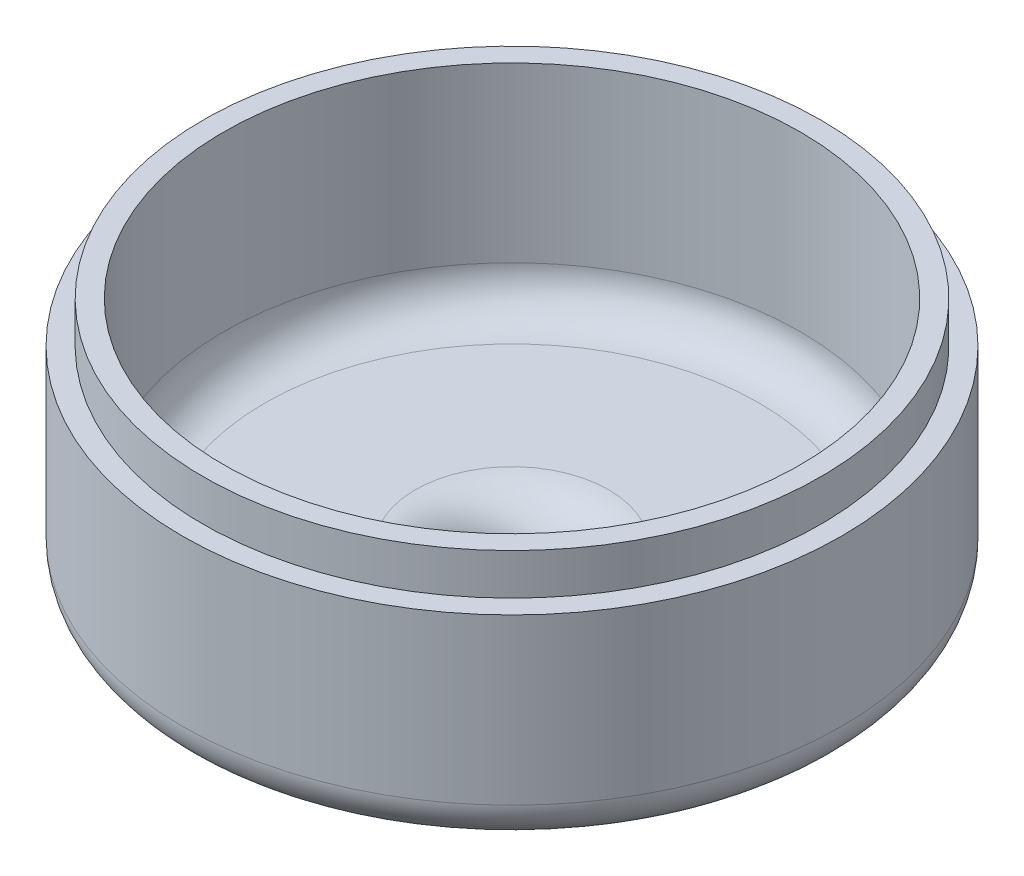
ISO-10303-21;
HEADER;
FILE_DESCRIPTION(('STEP AP214'),'2;1');
FILE_NAME('part.step','',(''),(''),'','','');
FILE_SCHEMA(('AUTOMOTIVE_DESIGN { 1 0 10303 214 1 1 1 1 }'));
ENDSEC;
DATA;
#1=APPLICATION_CONTEXT('core data for automotive mechanical design processes');
#2=APPLICATION_PROTOCOL_DEFINITION('international standard','automotive_design',2000,#1);
#3=PRODUCT_CONTEXT('',#1,'mechanical');
#4=PRODUCT('Part','Part','',(#3));
#5=PRODUCT_RELATED_PRODUCT_CATEGORY('part','',(#4));
#6=PRODUCT_DEFINITION_FORMATION('','',#4);
#7=PRODUCT_DEFINITION_CONTEXT('part definition',#1,'design');
#8=PRODUCT_DEFINITION('design','',#6,#7);
#9=PRODUCT_DEFINITION_SHAPE('','',#8);
#10=(LENGTH_UNIT() NAMED_UNIT(*) SI_UNIT(.MILLI.,.METRE.));
#11=(NAMED_UNIT(*) PLANE_ANGLE_UNIT() SI_UNIT($,.RADIAN.));
#12=(NAMED_UNIT(*) SI_UNIT($,.STERADIAN.) SOLID_ANGLE_UNIT());
#13=UNCERTAINTY_MEASURE_WITH_UNIT(LENGTH_MEASURE(1.E-05),#10,'distance_accuracy_value','');
#14=(GEOMETRIC_REPRESENTATION_CONTEXT(3) GLOBAL_UNCERTAINTY_ASSIGNED_CONTEXT((#13)) GLOBAL_UNIT_ASSIGNED_CONTEXT((#10,
#11,#12)) REPRESENTATION_CONTEXT('',''));
#15=CARTESIAN_POINT('',(0.,0.,0.));
#16=DIRECTION('',(0.,0.,1.));
#17=DIRECTION('',(1.,0.,0.));
#18=AXIS2_PLACEMENT_3D('',#15,#16,#17);
#19=CARTESIAN_POINT('',(0.,-26.,0.));
#20=DIRECTION('',(0.,-1.,0.));
#21=DIRECTION('',(0.,0.,-1.));
#22=AXIS2_PLACEMENT_3D('',#19,#20,#21);
#23=TOROIDAL_SURFACE('',#22,16.,6.);
#24=CARTESIAN_POINT('',(0.,-26.,0.));
#25=DIRECTION('',(0.,-1.,0.));
#26=DIRECTION('',(0.,0.,-1.));
#27=AXIS2_PLACEMENT_3D('',#24,#25,#26);
#28=CIRCLE('',#27,10.);
#29=CARTESIAN_POINT('',(0.,-26.,-10.));
#30=VERTEX_POINT('',#29);
#31=EDGE_CURVE('E10',#30,#30,#28,.T.);
#32=ORIENTED_EDGE('',*,*,#31,.F.);
#33=EDGE_LOOP('',(#32));
#34=FACE_BOUND('',#33,.T.);
#35=CARTESIAN_POINT('',(0.,-20.,0.));
#36=DIRECTION('',(0.,-1.,0.));
#37=DIRECTION('',(0.,0.,-1.));
#38=AXIS2_PLACEMENT_3D('',#35,#36,#37);
#39=CIRCLE('',#38,16.);
#40=CARTESIAN_POINT('',(0.,-20.,-16.));
#41=VERTEX_POINT('',#40);
#42=EDGE_CURVE('E77',#41,#41,#39,.T.);
#43=ORIENTED_EDGE('',*,*,#42,.T.);
#44=EDGE_LOOP('',(#43));
#45=FACE_BOUND('',#44,.T.);
#46=ADVANCED_FACE('F31',(#34,#45),#23,.F.);
#47=CARTESIAN_POINT('',(0.,0.,0.));
#48=DIRECTION('',(0.,-1.,0.));
#49=DIRECTION('',(0.,0.,-1.));
#50=AXIS2_PLACEMENT_3D('',#47,#48,#49);
#51=CYLINDRICAL_SURFACE('',#50,10.);
#52=CARTESIAN_POINT('',(0.,-28.4862875131965,0.));
#53=DIRECTION('',(0.,-1.,0.));
#54=DIRECTION('',(0.,0.,-1.));
#55=AXIS2_PLACEMENT_3D('',#52,#53,#54);
#56=CIRCLE('',#55,10.);
#57=CARTESIAN_POINT('',(0.,-28.4862875131965,-10.));
#58=VERTEX_POINT('',#57);
#59=EDGE_CURVE('E37',#58,#58,#56,.T.);
#60=ORIENTED_EDGE('',*,*,#59,.F.);
#61=EDGE_LOOP('',(#60));
#62=FACE_BOUND('',#61,.T.);
#63=ORIENTED_EDGE('',*,*,#31,.T.);
#64=EDGE_LOOP('',(#63));
#65=FACE_BOUND('',#64,.T.);
#66=ADVANCED_FACE('F150',(#62,#65),#51,.T.);
#67=CARTESIAN_POINT('',(-10.,-28.4862875131965,0.));
#68=DIRECTION('',(0.,1.,0.));
#69=DIRECTION('',(0.,0.,1.));
#70=AXIS2_PLACEMENT_3D('',#67,#68,#69);
#71=PLANE('',#70);
#72=CARTESIAN_POINT('',(0.,-28.4862875131965,0.));
#73=DIRECTION('',(0.,-1.,0.));
#74=DIRECTION('',(0.,0.,-1.));
#75=AXIS2_PLACEMENT_3D('',#72,#73,#74);
#76=CIRCLE('',#75,5.75);
#77=CARTESIAN_POINT('',(0.,-28.4862875131965,-5.75));
#78=VERTEX_POINT('',#77);
#79=EDGE_CURVE('E41',#78,#78,#76,.T.);
#80=ORIENTED_EDGE('',*,*,#79,.F.);
#81=EDGE_LOOP('',(#80));
#82=FACE_BOUND('',#81,.T.);
#83=ORIENTED_EDGE('',*,*,#59,.T.);
#84=EDGE_LOOP('',(#83));
#85=FACE_BOUND('',#84,.T.);
#86=ADVANCED_FACE('F145',(#82,#85),#71,.F.);
#87=CARTESIAN_POINT('',(0.,0.,0.));
#88=DIRECTION('',(0.,-1.,0.));
#89=DIRECTION('',(0.,0.,-1.));
#90=AXIS2_PLACEMENT_3D('',#87,#88,#89);
#91=CYLINDRICAL_SURFACE('',#90,5.75);
#92=CARTESIAN_POINT('',(0.,-22.,0.));
#93=DIRECTION('',(0.,-1.,0.));
#94=DIRECTION('',(0.,0.,-1.));
#95=AXIS2_PLACEMENT_3D('',#92,#93,#94);
#96=CIRCLE('',#95,5.75);
#97=CARTESIAN_POINT('',(0.,-22.,-5.75));
#98=VERTEX_POINT('',#97);
#99=EDGE_CURVE('E45',#98,#98,#96,.T.);
#100=ORIENTED_EDGE('',*,*,#99,.F.);
#101=EDGE_LOOP('',(#100));
#102=FACE_BOUND('',#101,.T.);
#103=ORIENTED_EDGE('',*,*,#79,.T.);
#104=EDGE_LOOP('',(#103));
#105=FACE_BOUND('',#104,.T.);
#106=ADVANCED_FACE('F139',(#102,#105),#91,.F.);
#107=CARTESIAN_POINT('',(0.,-22.,0.));
#108=DIRECTION('',(0.,-1.,0.));
#109=DIRECTION('',(0.,0.,-1.));
#110=AXIS2_PLACEMENT_3D('',#107,#108,#109);
#111=TOROIDAL_SURFACE('',#110,11.75,6.);
#112=CARTESIAN_POINT('',(0.,-16.,0.));
#113=DIRECTION('',(0.,-1.,0.));
#114=DIRECTION('',(0.,0.,-1.));
#115=AXIS2_PLACEMENT_3D('',#112,#113,#114);
#116=CIRCLE('',#115,11.75);
#117=CARTESIAN_POINT('',(0.,-16.,-11.75));
#118=VERTEX_POINT('',#117);
#119=EDGE_CURVE('E50',#118,#118,#116,.T.);
#120=ORIENTED_EDGE('',*,*,#119,.F.);
#121=EDGE_LOOP('',(#120));
#122=FACE_BOUND('',#121,.T.);
#123=ORIENTED_EDGE('',*,*,#99,.T.);
#124=EDGE_LOOP('',(#123));
#125=FACE_BOUND('',#124,.T.);
#126=ADVANCED_FACE('F133',(#122,#125),#111,.T.);
#127=CARTESIAN_POINT('',(-30.,-16.,0.));
#128=DIRECTION('',(0.,-1.,0.));
#129=DIRECTION('',(0.,0.,-1.));
#130=AXIS2_PLACEMENT_3D('',#127,#128,#129);
#131=PLANE('',#130);
#132=CARTESIAN_POINT('',(0.,-16.,0.));
#133=DIRECTION('',(0.,-1.,0.));
#134=DIRECTION('',(0.,0.,-1.));
#135=AXIS2_PLACEMENT_3D('',#132,#133,#134);
#136=CIRCLE('',#135,30.);
#137=CARTESIAN_POINT('',(0.,-16.,-30.));
#138=VERTEX_POINT('',#137);
#139=EDGE_CURVE('E53',#138,#138,#136,.T.);
#140=ORIENTED_EDGE('',*,*,#139,.F.);
#141=EDGE_LOOP('',(#140));
#142=FACE_BOUND('',#141,.T.);
#143=ORIENTED_EDGE('',*,*,#119,.T.);
#144=EDGE_LOOP('',(#143));
#145=FACE_BOUND('',#144,.T.);
#146=ADVANCED_FACE('F127',(#142,#145),#131,.F.);
#147=CARTESIAN_POINT('',(0.,-11.,0.));
#148=DIRECTION('',(0.,-1.,0.));
#149=DIRECTION('',(0.,0.,-1.));
#150=AXIS2_PLACEMENT_3D('',#147,#148,#149);
#151=TOROIDAL_SURFACE('',#150,30.,5.00000000000001);
#152=CARTESIAN_POINT('',(0.,-11.,0.));
#153=DIRECTION('',(0.,-1.,0.));
#154=DIRECTION('',(0.,0.,-1.));
#155=AXIS2_PLACEMENT_3D('',#152,#153,#154);
#156=CIRCLE('',#155,35.);
#157=CARTESIAN_POINT('',(0.,-11.,-35.));
#158=VERTEX_POINT('',#157);
#159=EDGE_CURVE('E56',#158,#158,#156,.T.);
#160=ORIENTED_EDGE('',*,*,#159,.F.);
#161=EDGE_LOOP('',(#160));
#162=FACE_BOUND('',#161,.T.);
#163=ORIENTED_EDGE('',*,*,#139,.T.);
#164=EDGE_LOOP('',(#163));
#165=FACE_BOUND('',#164,.T.);
#166=ADVANCED_FACE('F121',(#162,#165),#151,.F.);
#167=CARTESIAN_POINT('',(0.,0.,0.));
#168=DIRECTION('',(0.,-1.,0.));
#169=DIRECTION('',(0.,0.,-1.));
#170=AXIS2_PLACEMENT_3D('',#167,#168,#169);
#171=CYLINDRICAL_SURFACE('',#170,35.);
#172=CARTESIAN_POINT('',(0.,10.,0.));
#173=DIRECTION('',(0.,-1.,0.));
#174=DIRECTION('',(0.,0.,-1.));
#175=AXIS2_PLACEMENT_3D('',#172,#173,#174);
#176=CIRCLE('',#175,35.);
#177=CARTESIAN_POINT('',(0.,10.,-35.));
#178=VERTEX_POINT('',#177);
#179=EDGE_CURVE('E59',#178,#178,#176,.T.);
#180=ORIENTED_EDGE('',*,*,#179,.F.);
#181=EDGE_LOOP('',(#180));
#182=FACE_BOUND('',#181,.T.);
#183=ORIENTED_EDGE('',*,*,#159,.T.);
#184=EDGE_LOOP('',(#183));
#185=FACE_BOUND('',#184,.T.);
#186=ADVANCED_FACE('F115',(#182,#185),#171,.F.);
#187=CARTESIAN_POINT('',(-37.5,10.,0.));
#188=DIRECTION('',(0.,-1.,0.));
#189=DIRECTION('',(0.,0.,-1.));
#190=AXIS2_PLACEMENT_3D('',#187,#188,#189);
#191=PLANE('',#190);
#192=CARTESIAN_POINT('',(0.,10.,0.));
#193=DIRECTION('',(0.,-1.,0.));
#194=DIRECTION('',(0.,0.,-1.));
#195=AXIS2_PLACEMENT_3D('',#192,#193,#194);
#196=CIRCLE('',#195,37.5);
#197=CARTESIAN_POINT('',(0.,10.,-37.5));
#198=VERTEX_POINT('',#197);
#199=EDGE_CURVE('E62',#198,#198,#196,.T.);
#200=ORIENTED_EDGE('',*,*,#199,.F.);
#201=EDGE_LOOP('',(#200));
#202=FACE_BOUND('',#201,.T.);
#203=ORIENTED_EDGE('',*,*,#179,.T.);
#204=EDGE_LOOP('',(#203));
#205=FACE_BOUND('',#204,.T.);
#206=ADVANCED_FACE('F109',(#202,#205),#191,.F.);
#207=CARTESIAN_POINT('',(0.,0.,0.));
#208=DIRECTION('',(0.,-1.,0.));
#209=DIRECTION('',(0.,0.,-1.));
#210=AXIS2_PLACEMENT_3D('',#207,#208,#209);
#211=CYLINDRICAL_SURFACE('',#210,37.5);
#212=CARTESIAN_POINT('',(0.,5.,0.));
#213=DIRECTION('',(0.,-1.,0.));
#214=DIRECTION('',(0.,0.,-1.));
#215=AXIS2_PLACEMENT_3D('',#212,#213,#214);
#216=CIRCLE('',#215,37.5);
#217=CARTESIAN_POINT('',(0.,5.,-37.5));
#218=VERTEX_POINT('',#217);
#219=EDGE_CURVE('E65',#218,#218,#216,.T.);
#220=ORIENTED_EDGE('',*,*,#219,.F.);
#221=EDGE_LOOP('',(#220));
#222=FACE_BOUND('',#221,.T.);
#223=ORIENTED_EDGE('',*,*,#199,.T.);
#224=EDGE_LOOP('',(#223));
#225=FACE_BOUND('',#224,.T.);
#226=ADVANCED_FACE('F103',(#222,#225),#211,.T.);
#227=CARTESIAN_POINT('',(-37.5,5.,0.));
#228=DIRECTION('',(0.,-1.,0.));
#229=DIRECTION('',(0.,0.,-1.));
#230=AXIS2_PLACEMENT_3D('',#227,#228,#229);
#231=PLANE('',#230);
#232=CARTESIAN_POINT('',(0.,4.99999999999999,0.));
#233=DIRECTION('',(0.,-1.,0.));
#234=DIRECTION('',(0.,0.,-1.));
#235=AXIS2_PLACEMENT_3D('',#232,#233,#234);
#236=CIRCLE('',#235,40.);
#237=CARTESIAN_POINT('',(0.,4.99999999999999,-40.));
#238=VERTEX_POINT('',#237);
#239=EDGE_CURVE('E68',#238,#238,#236,.T.);
#240=ORIENTED_EDGE('',*,*,#239,.F.);
#241=EDGE_LOOP('',(#240));
#242=FACE_BOUND('',#241,.T.);
#243=ORIENTED_EDGE('',*,*,#219,.T.);
#244=EDGE_LOOP('',(#243));
#245=FACE_BOUND('',#244,.T.);
#246=ADVANCED_FACE('F97',(#242,#245),#231,.F.);
#247=CARTESIAN_POINT('',(0.,0.,0.));
#248=DIRECTION('',(0.,-1.,0.));
#249=DIRECTION('',(0.,0.,-1.));
#250=AXIS2_PLACEMENT_3D('',#247,#248,#249);
#251=CYLINDRICAL_SURFACE('',#250,40.);
#252=CARTESIAN_POINT('',(0.,-15.,0.));
#253=DIRECTION('',(0.,-1.,0.));
#254=DIRECTION('',(0.,0.,-1.));
#255=AXIS2_PLACEMENT_3D('',#252,#253,#254);
#256=CIRCLE('',#255,40.);
#257=CARTESIAN_POINT('',(0.,-15.,-40.));
#258=VERTEX_POINT('',#257);
#259=EDGE_CURVE('E71',#258,#258,#256,.T.);
#260=ORIENTED_EDGE('',*,*,#259,.F.);
#261=EDGE_LOOP('',(#260));
#262=FACE_BOUND('',#261,.T.);
#263=ORIENTED_EDGE('',*,*,#239,.T.);
#264=EDGE_LOOP('',(#263));
#265=FACE_BOUND('',#264,.T.);
#266=ADVANCED_FACE('F91',(#262,#265),#251,.T.);
#267=CARTESIAN_POINT('',(0.,-15.,0.));
#268=DIRECTION('',(0.,-1.,0.));
#269=DIRECTION('',(0.,0.,-1.));
#270=AXIS2_PLACEMENT_3D('',#267,#268,#269);
#271=TOROIDAL_SURFACE('',#270,35.,5.);
#272=CARTESIAN_POINT('',(0.,-20.,0.));
#273=DIRECTION('',(0.,-1.,0.));
#274=DIRECTION('',(0.,0.,-1.));
#275=AXIS2_PLACEMENT_3D('',#272,#273,#274);
#276=CIRCLE('',#275,35.);
#277=CARTESIAN_POINT('',(0.,-20.,-35.));
#278=VERTEX_POINT('',#277);
#279=EDGE_CURVE('E74',#278,#278,#276,.T.);
#280=ORIENTED_EDGE('',*,*,#279,.F.);
#281=EDGE_LOOP('',(#280));
#282=FACE_BOUND('',#281,.T.);
#283=ORIENTED_EDGE('',*,*,#259,.T.);
#284=EDGE_LOOP('',(#283));
#285=FACE_BOUND('',#284,.T.);
#286=ADVANCED_FACE('F85',(#282,#285),#271,.T.);
#287=CARTESIAN_POINT('',(-35.,-20.,0.));
#288=DIRECTION('',(0.,1.,0.));
#289=DIRECTION('',(0.,0.,1.));
#290=AXIS2_PLACEMENT_3D('',#287,#288,#289);
#291=PLANE('',#290);
#292=ORIENTED_EDGE('',*,*,#42,.F.);
#293=EDGE_LOOP('',(#292));
#294=FACE_BOUND('',#293,.T.);
#295=ORIENTED_EDGE('',*,*,#279,.T.);
#296=EDGE_LOOP('',(#295));
#297=FACE_BOUND('',#296,.T.);
#298=ADVANCED_FACE('F82',(#294,#297),#291,.F.);
#299=CLOSED_SHELL('',(#46,#66,#86,#106,#126,#146,#166,#186,#206,#226,#246,#266,#286,#298));
#300=MANIFOLD_SOLID_BREP('B2',#299);
#301=ADVANCED_BREP_SHAPE_REPRESENTATION('',(#18,#300),#14);
#302=SHAPE_DEFINITION_REPRESENTATION(#9,#301);
ENDSEC;
END-ISO-10303-21;
